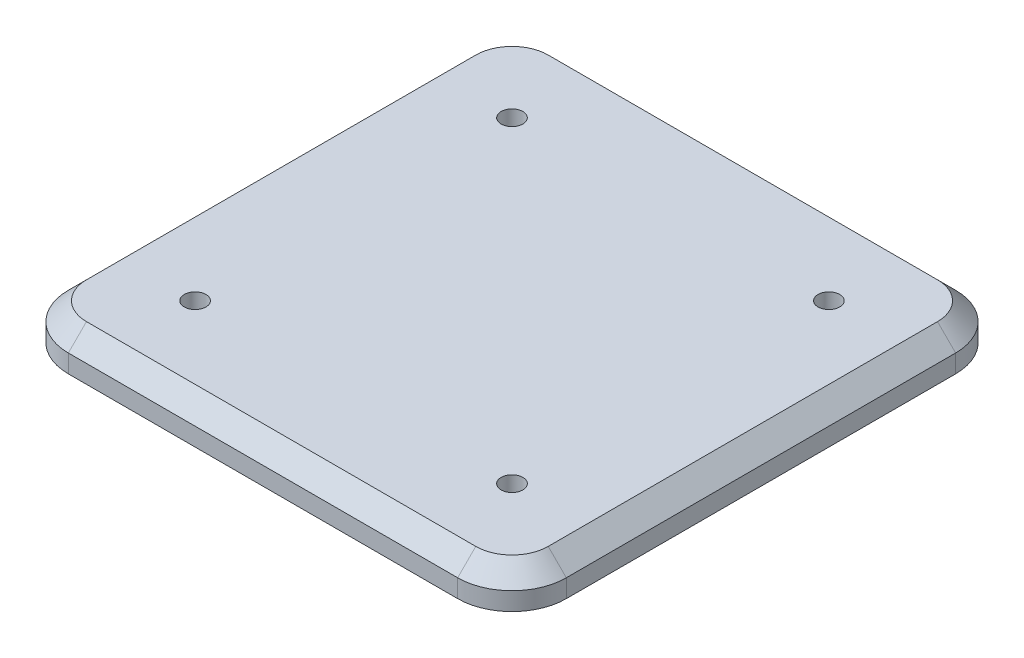
ISO-10303-21;
HEADER;
FILE_DESCRIPTION(('STEP AP214'),'2;1');
FILE_NAME('part.step','',(''),(''),'','','');
FILE_SCHEMA(('AUTOMOTIVE_DESIGN { 1 0 10303 214 1 1 1 1 }'));
ENDSEC;
DATA;
#1=APPLICATION_CONTEXT('core data for automotive mechanical design processes');
#2=APPLICATION_PROTOCOL_DEFINITION('international standard','automotive_design',2000,#1);
#3=PRODUCT_CONTEXT('',#1,'mechanical');
#4=PRODUCT('Part','Part','',(#3));
#5=PRODUCT_RELATED_PRODUCT_CATEGORY('part','',(#4));
#6=PRODUCT_DEFINITION_FORMATION('','',#4);
#7=PRODUCT_DEFINITION_CONTEXT('part definition',#1,'design');
#8=PRODUCT_DEFINITION('design','',#6,#7);
#9=PRODUCT_DEFINITION_SHAPE('','',#8);
#10=(LENGTH_UNIT() NAMED_UNIT(*) SI_UNIT(.MILLI.,.METRE.));
#11=(NAMED_UNIT(*) PLANE_ANGLE_UNIT() SI_UNIT($,.RADIAN.));
#12=(NAMED_UNIT(*) SI_UNIT($,.STERADIAN.) SOLID_ANGLE_UNIT());
#13=UNCERTAINTY_MEASURE_WITH_UNIT(LENGTH_MEASURE(1.E-05),#10,'distance_accuracy_value','');
#14=(GEOMETRIC_REPRESENTATION_CONTEXT(3) GLOBAL_UNCERTAINTY_ASSIGNED_CONTEXT((#13)) GLOBAL_UNIT_ASSIGNED_CONTEXT((#10,
#11,#12)) REPRESENTATION_CONTEXT('',''));
#15=CARTESIAN_POINT('',(0.,0.,0.));
#16=DIRECTION('',(0.,0.,1.));
#17=DIRECTION('',(1.,0.,0.));
#18=AXIS2_PLACEMENT_3D('',#15,#16,#17);
#19=CARTESIAN_POINT('',(-107.5,10.,107.5));
#20=DIRECTION('',(0.,-1.,0.));
#21=DIRECTION('',(0.,0.,-1.));
#22=AXIS2_PLACEMENT_3D('',#19,#20,#21);
#23=CYLINDRICAL_SURFACE('',#22,30.);
#24=DIRECTION('',(0.,-1.,0.));
#25=VECTOR('',#24,1.);
#26=CARTESIAN_POINT('',(-107.5,10.,137.5));
#27=LINE('',#26,#25);
#28=CARTESIAN_POINT('',(-107.5,0.,137.5));
#29=VERTEX_POINT('',#28);
#30=CARTESIAN_POINT('',(-107.5,-10.,137.5));
#31=VERTEX_POINT('',#30);
#32=EDGE_CURVE('E133',#29,#31,#27,.T.);
#33=ORIENTED_EDGE('',*,*,#32,.F.);
#34=CARTESIAN_POINT('',(-107.5,0.,107.5));
#35=DIRECTION('',(0.,-1.,0.));
#36=DIRECTION('',(0.,0.,-1.));
#37=AXIS2_PLACEMENT_3D('',#34,#35,#36);
#38=CIRCLE('',#37,30.);
#39=CARTESIAN_POINT('',(-137.5,0.,107.5));
#40=VERTEX_POINT('',#39);
#41=EDGE_CURVE('E12',#29,#40,#38,.T.);
#42=ORIENTED_EDGE('',*,*,#41,.T.);
#43=DIRECTION('',(0.,-1.,0.));
#44=VECTOR('',#43,1.);
#45=CARTESIAN_POINT('',(-137.5,10.,107.5));
#46=LINE('',#45,#44);
#47=CARTESIAN_POINT('',(-137.5,-10.,107.5));
#48=VERTEX_POINT('',#47);
#49=EDGE_CURVE('E156',#40,#48,#46,.T.);
#50=ORIENTED_EDGE('',*,*,#49,.T.);
#51=CARTESIAN_POINT('',(-107.5,-10.,107.5));
#52=DIRECTION('',(0.,1.,0.));
#53=DIRECTION('',(0.,0.,-1.));
#54=AXIS2_PLACEMENT_3D('',#51,#52,#53);
#55=CIRCLE('',#54,30.);
#56=EDGE_CURVE('E149',#48,#31,#55,.T.);
#57=ORIENTED_EDGE('',*,*,#56,.T.);
#58=EDGE_LOOP('',(#33,#42,#50,#57));
#59=FACE_BOUND('',#58,.T.);
#60=ADVANCED_FACE('F43',(#59),#23,.T.);
#61=CARTESIAN_POINT('',(107.5,10.,137.5));
#62=DIRECTION('',(0.,0.,-1.));
#63=DIRECTION('',(-1.,0.,0.));
#64=AXIS2_PLACEMENT_3D('',#61,#62,#63);
#65=PLANE('',#64);
#66=DIRECTION('',(0.,-1.,0.));
#67=VECTOR('',#66,1.);
#68=CARTESIAN_POINT('',(107.5,10.,137.5));
#69=LINE('',#68,#67);
#70=CARTESIAN_POINT('',(107.5,0.,137.5));
#71=VERTEX_POINT('',#70);
#72=CARTESIAN_POINT('',(107.5,-10.,137.5));
#73=VERTEX_POINT('',#72);
#74=EDGE_CURVE('E143',#71,#73,#69,.T.);
#75=ORIENTED_EDGE('',*,*,#74,.F.);
#76=DIRECTION('',(-1.,0.,0.));
#77=VECTOR('',#76,1.);
#78=CARTESIAN_POINT('',(107.5,0.,137.5));
#79=LINE('',#78,#77);
#80=EDGE_CURVE('E54',#71,#29,#79,.T.);
#81=ORIENTED_EDGE('',*,*,#80,.T.);
#82=ORIENTED_EDGE('',*,*,#32,.T.);
#83=DIRECTION('',(1.,0.,0.));
#84=VECTOR('',#83,1.);
#85=CARTESIAN_POINT('',(107.5,-10.,137.5));
#86=LINE('',#85,#84);
#87=EDGE_CURVE('E136',#31,#73,#86,.T.);
#88=ORIENTED_EDGE('',*,*,#87,.T.);
#89=EDGE_LOOP('',(#75,#81,#82,#88));
#90=FACE_BOUND('',#89,.T.);
#91=ADVANCED_FACE('F135',(#90),#65,.F.);
#92=CARTESIAN_POINT('',(107.5,10.,107.5));
#93=DIRECTION('',(0.,-1.,0.));
#94=DIRECTION('',(0.,0.,-1.));
#95=AXIS2_PLACEMENT_3D('',#92,#93,#94);
#96=CYLINDRICAL_SURFACE('',#95,30.);
#97=DIRECTION('',(0.,-1.,0.));
#98=VECTOR('',#97,1.);
#99=CARTESIAN_POINT('',(137.5,10.,107.5));
#100=LINE('',#99,#98);
#101=CARTESIAN_POINT('',(137.5,0.,107.5));
#102=VERTEX_POINT('',#101);
#103=CARTESIAN_POINT('',(137.5,-10.,107.5));
#104=VERTEX_POINT('',#103);
#105=EDGE_CURVE('E202',#102,#104,#100,.T.);
#106=ORIENTED_EDGE('',*,*,#105,.F.);
#107=CARTESIAN_POINT('',(107.5,0.,107.5));
#108=DIRECTION('',(0.,-1.,0.));
#109=DIRECTION('',(0.,0.,-1.));
#110=AXIS2_PLACEMENT_3D('',#107,#108,#109);
#111=CIRCLE('',#110,30.);
#112=EDGE_CURVE('E69',#102,#71,#111,.T.);
#113=ORIENTED_EDGE('',*,*,#112,.T.);
#114=ORIENTED_EDGE('',*,*,#74,.T.);
#115=CARTESIAN_POINT('',(107.5,-10.,107.5));
#116=DIRECTION('',(0.,1.,0.));
#117=DIRECTION('',(0.,0.,-1.));
#118=AXIS2_PLACEMENT_3D('',#115,#116,#117);
#119=CIRCLE('',#118,30.);
#120=EDGE_CURVE('E152',#73,#104,#119,.T.);
#121=ORIENTED_EDGE('',*,*,#120,.T.);
#122=EDGE_LOOP('',(#106,#113,#114,#121));
#123=FACE_BOUND('',#122,.T.);
#124=ADVANCED_FACE('F329',(#123),#96,.T.);
#125=CARTESIAN_POINT('',(137.5,10.,-107.5));
#126=DIRECTION('',(-1.,0.,0.));
#127=DIRECTION('',(0.,0.,1.));
#128=AXIS2_PLACEMENT_3D('',#125,#126,#127);
#129=PLANE('',#128);
#130=DIRECTION('',(0.,-1.,0.));
#131=VECTOR('',#130,1.);
#132=CARTESIAN_POINT('',(137.5,10.,-107.5));
#133=LINE('',#132,#131);
#134=CARTESIAN_POINT('',(137.5,0.,-107.5));
#135=VERTEX_POINT('',#134);
#136=CARTESIAN_POINT('',(137.5,-10.,-107.5));
#137=VERTEX_POINT('',#136);
#138=EDGE_CURVE('E199',#135,#137,#133,.T.);
#139=ORIENTED_EDGE('',*,*,#138,.F.);
#140=DIRECTION('',(0.,0.,1.));
#141=VECTOR('',#140,1.);
#142=CARTESIAN_POINT('',(137.5,0.,-107.5));
#143=LINE('',#142,#141);
#144=EDGE_CURVE('E244',#135,#102,#143,.T.);
#145=ORIENTED_EDGE('',*,*,#144,.T.);
#146=ORIENTED_EDGE('',*,*,#105,.T.);
#147=DIRECTION('',(0.,0.,-1.));
#148=VECTOR('',#147,1.);
#149=CARTESIAN_POINT('',(137.5,-10.,-107.5));
#150=LINE('',#149,#148);
#151=EDGE_CURVE('E169',#104,#137,#150,.T.);
#152=ORIENTED_EDGE('',*,*,#151,.T.);
#153=EDGE_LOOP('',(#139,#145,#146,#152));
#154=FACE_BOUND('',#153,.T.);
#155=ADVANCED_FACE('F327',(#154),#129,.F.);
#156=CARTESIAN_POINT('',(107.5,10.,-107.5));
#157=DIRECTION('',(0.,-1.,0.));
#158=DIRECTION('',(0.,0.,-1.));
#159=AXIS2_PLACEMENT_3D('',#156,#157,#158);
#160=CYLINDRICAL_SURFACE('',#159,30.);
#161=DIRECTION('',(0.,-1.,0.));
#162=VECTOR('',#161,1.);
#163=CARTESIAN_POINT('',(107.5,10.,-137.5));
#164=LINE('',#163,#162);
#165=CARTESIAN_POINT('',(107.5,0.,-137.5));
#166=VERTEX_POINT('',#165);
#167=CARTESIAN_POINT('',(107.5,-10.,-137.5));
#168=VERTEX_POINT('',#167);
#169=EDGE_CURVE('E196',#166,#168,#164,.T.);
#170=ORIENTED_EDGE('',*,*,#169,.F.);
#171=CARTESIAN_POINT('',(107.5,0.,-107.5));
#172=DIRECTION('',(0.,-1.,0.));
#173=DIRECTION('',(0.,0.,-1.));
#174=AXIS2_PLACEMENT_3D('',#171,#172,#173);
#175=CIRCLE('',#174,30.);
#176=EDGE_CURVE('E241',#166,#135,#175,.T.);
#177=ORIENTED_EDGE('',*,*,#176,.T.);
#178=ORIENTED_EDGE('',*,*,#138,.T.);
#179=CARTESIAN_POINT('',(107.5,-10.,-107.5));
#180=DIRECTION('',(0.,1.,0.));
#181=DIRECTION('',(0.,0.,-1.));
#182=AXIS2_PLACEMENT_3D('',#179,#180,#181);
#183=CIRCLE('',#182,30.);
#184=EDGE_CURVE('E173',#137,#168,#183,.T.);
#185=ORIENTED_EDGE('',*,*,#184,.T.);
#186=EDGE_LOOP('',(#170,#177,#178,#185));
#187=FACE_BOUND('',#186,.T.);
#188=ADVANCED_FACE('F325',(#187),#160,.T.);
#189=CARTESIAN_POINT('',(-107.5,10.,-137.5));
#190=DIRECTION('',(0.,0.,1.));
#191=DIRECTION('',(1.,0.,0.));
#192=AXIS2_PLACEMENT_3D('',#189,#190,#191);
#193=PLANE('',#192);
#194=DIRECTION('',(0.,-1.,0.));
#195=VECTOR('',#194,1.);
#196=CARTESIAN_POINT('',(-107.5,10.,-137.5));
#197=LINE('',#196,#195);
#198=CARTESIAN_POINT('',(-107.5,0.,-137.5));
#199=VERTEX_POINT('',#198);
#200=CARTESIAN_POINT('',(-107.5,-10.,-137.5));
#201=VERTEX_POINT('',#200);
#202=EDGE_CURVE('E193',#199,#201,#197,.T.);
#203=ORIENTED_EDGE('',*,*,#202,.F.);
#204=DIRECTION('',(1.,0.,0.));
#205=VECTOR('',#204,1.);
#206=CARTESIAN_POINT('',(-107.5,0.,-137.5));
#207=LINE('',#206,#205);
#208=EDGE_CURVE('E238',#199,#166,#207,.T.);
#209=ORIENTED_EDGE('',*,*,#208,.T.);
#210=ORIENTED_EDGE('',*,*,#169,.T.);
#211=DIRECTION('',(-1.,0.,0.));
#212=VECTOR('',#211,1.);
#213=CARTESIAN_POINT('',(-107.5,-10.,-137.5));
#214=LINE('',#213,#212);
#215=EDGE_CURVE('E177',#168,#201,#214,.T.);
#216=ORIENTED_EDGE('',*,*,#215,.T.);
#217=EDGE_LOOP('',(#203,#209,#210,#216));
#218=FACE_BOUND('',#217,.T.);
#219=ADVANCED_FACE('F313',(#218),#193,.F.);
#220=CARTESIAN_POINT('',(-107.5,10.,-107.5));
#221=DIRECTION('',(0.,-1.,0.));
#222=DIRECTION('',(0.,0.,-1.));
#223=AXIS2_PLACEMENT_3D('',#220,#221,#222);
#224=CYLINDRICAL_SURFACE('',#223,30.);
#225=DIRECTION('',(0.,-1.,0.));
#226=VECTOR('',#225,1.);
#227=CARTESIAN_POINT('',(-137.5,10.,-107.5));
#228=LINE('',#227,#226);
#229=CARTESIAN_POINT('',(-137.5,0.,-107.5));
#230=VERTEX_POINT('',#229);
#231=CARTESIAN_POINT('',(-137.5,-10.,-107.5));
#232=VERTEX_POINT('',#231);
#233=EDGE_CURVE('E190',#230,#232,#228,.T.);
#234=ORIENTED_EDGE('',*,*,#233,.F.);
#235=CARTESIAN_POINT('',(-107.5,0.,-107.5));
#236=DIRECTION('',(0.,-1.,0.));
#237=DIRECTION('',(0.,0.,-1.));
#238=AXIS2_PLACEMENT_3D('',#235,#236,#237);
#239=CIRCLE('',#238,30.);
#240=EDGE_CURVE('E235',#230,#199,#239,.T.);
#241=ORIENTED_EDGE('',*,*,#240,.T.);
#242=ORIENTED_EDGE('',*,*,#202,.T.);
#243=CARTESIAN_POINT('',(-107.5,-10.,-107.5));
#244=DIRECTION('',(0.,1.,0.));
#245=DIRECTION('',(0.,0.,1.));
#246=AXIS2_PLACEMENT_3D('',#243,#244,#245);
#247=CIRCLE('',#246,30.);
#248=EDGE_CURVE('E181',#201,#232,#247,.T.);
#249=ORIENTED_EDGE('',*,*,#248,.T.);
#250=EDGE_LOOP('',(#234,#241,#242,#249));
#251=FACE_BOUND('',#250,.T.);
#252=ADVANCED_FACE('F310',(#251),#224,.T.);
#253=CARTESIAN_POINT('',(-137.5,10.,107.5));
#254=DIRECTION('',(1.,0.,0.));
#255=DIRECTION('',(0.,0.,-1.));
#256=AXIS2_PLACEMENT_3D('',#253,#254,#255);
#257=PLANE('',#256);
#258=ORIENTED_EDGE('',*,*,#49,.F.);
#259=DIRECTION('',(0.,0.,-1.));
#260=VECTOR('',#259,1.);
#261=CARTESIAN_POINT('',(-137.5,0.,107.5));
#262=LINE('',#261,#260);
#263=EDGE_CURVE('E231',#40,#230,#262,.T.);
#264=ORIENTED_EDGE('',*,*,#263,.T.);
#265=ORIENTED_EDGE('',*,*,#233,.T.);
#266=DIRECTION('',(0.,0.,1.));
#267=VECTOR('',#266,1.);
#268=CARTESIAN_POINT('',(-137.5,-10.,107.5));
#269=LINE('',#268,#267);
#270=EDGE_CURVE('E185',#232,#48,#269,.T.);
#271=ORIENTED_EDGE('',*,*,#270,.T.);
#272=EDGE_LOOP('',(#258,#264,#265,#271));
#273=FACE_BOUND('',#272,.T.);
#274=ADVANCED_FACE('F297',(#273),#257,.F.);
#275=CARTESIAN_POINT('',(-107.5,10.,107.5));
#276=DIRECTION('',(0.,-1.,0.));
#277=DIRECTION('',(0.,0.,-1.));
#278=AXIS2_PLACEMENT_3D('',#275,#276,#277);
#279=PLANE('',#278);
#280=CARTESIAN_POINT('',(-87.5,10.,-87.5));
#281=DIRECTION('',(0.,1.,0.));
#282=DIRECTION('',(0.,0.,-1.));
#283=AXIS2_PLACEMENT_3D('',#280,#281,#282);
#284=CIRCLE('',#283,6.);
#285=CARTESIAN_POINT('',(-87.5,10.,-93.5));
#286=VERTEX_POINT('',#285);
#287=EDGE_CURVE('E629',#286,#286,#284,.T.);
#288=ORIENTED_EDGE('',*,*,#287,.F.);
#289=EDGE_LOOP('',(#288));
#290=FACE_BOUND('',#289,.T.);
#291=CARTESIAN_POINT('',(87.5,10.,87.5));
#292=DIRECTION('',(0.,1.,0.));
#293=DIRECTION('',(0.,0.,-1.));
#294=AXIS2_PLACEMENT_3D('',#291,#292,#293);
#295=CIRCLE('',#294,6.);
#296=CARTESIAN_POINT('',(87.5,10.,81.5));
#297=VERTEX_POINT('',#296);
#298=EDGE_CURVE('E628',#297,#297,#295,.T.);
#299=ORIENTED_EDGE('',*,*,#298,.F.);
#300=EDGE_LOOP('',(#299));
#301=FACE_BOUND('',#300,.T.);
#302=CARTESIAN_POINT('',(-87.5,10.,87.5));
#303=DIRECTION('',(0.,1.,0.));
#304=DIRECTION('',(0.,0.,1.));
#305=AXIS2_PLACEMENT_3D('',#302,#303,#304);
#306=CIRCLE('',#305,6.);
#307=CARTESIAN_POINT('',(-87.5,10.,93.5));
#308=VERTEX_POINT('',#307);
#309=EDGE_CURVE('E620',#308,#308,#306,.T.);
#310=ORIENTED_EDGE('',*,*,#309,.F.);
#311=EDGE_LOOP('',(#310));
#312=FACE_BOUND('',#311,.T.);
#313=CARTESIAN_POINT('',(87.5,10.,-87.5));
#314=DIRECTION('',(0.,1.,0.));
#315=DIRECTION('',(0.,0.,1.));
#316=AXIS2_PLACEMENT_3D('',#313,#314,#315);
#317=CIRCLE('',#316,6.);
#318=CARTESIAN_POINT('',(87.5,10.,-81.5));
#319=VERTEX_POINT('',#318);
#320=EDGE_CURVE('E638',#319,#319,#317,.T.);
#321=ORIENTED_EDGE('',*,*,#320,.F.);
#322=EDGE_LOOP('',(#321));
#323=FACE_BOUND('',#322,.T.);
#324=CARTESIAN_POINT('',(-107.5,10.,-107.5));
#325=DIRECTION('',(0.,-1.,0.));
#326=DIRECTION('',(0.,0.,-1.));
#327=AXIS2_PLACEMENT_3D('',#324,#325,#326);
#328=CIRCLE('',#327,20.);
#329=CARTESIAN_POINT('',(-107.5,10.,-127.5));
#330=VERTEX_POINT('',#329);
#331=CARTESIAN_POINT('',(-127.5,10.,-107.5));
#332=VERTEX_POINT('',#331);
#333=EDGE_CURVE('E224',#330,#332,#328,.F.);
#334=ORIENTED_EDGE('',*,*,#333,.T.);
#335=DIRECTION('',(0.,0.,1.));
#336=VECTOR('',#335,1.);
#337=CARTESIAN_POINT('',(-127.5,10.,107.5));
#338=LINE('',#337,#336);
#339=CARTESIAN_POINT('',(-127.5,10.,107.5));
#340=VERTEX_POINT('',#339);
#341=EDGE_CURVE('E227',#332,#340,#338,.T.);
#342=ORIENTED_EDGE('',*,*,#341,.T.);
#343=CARTESIAN_POINT('',(-107.5,10.,107.5));
#344=DIRECTION('',(0.,-1.,0.));
#345=DIRECTION('',(0.,0.,-1.));
#346=AXIS2_PLACEMENT_3D('',#343,#344,#345);
#347=CIRCLE('',#346,20.);
#348=CARTESIAN_POINT('',(-107.5,10.,127.5));
#349=VERTEX_POINT('',#348);
#350=EDGE_CURVE('E142',#340,#349,#347,.F.);
#351=ORIENTED_EDGE('',*,*,#350,.T.);
#352=DIRECTION('',(1.,0.,0.));
#353=VECTOR('',#352,1.);
#354=CARTESIAN_POINT('',(-107.5,10.,127.5));
#355=LINE('',#354,#353);
#356=CARTESIAN_POINT('',(107.5,10.,127.5));
#357=VERTEX_POINT('',#356);
#358=EDGE_CURVE('E209',#349,#357,#355,.T.);
#359=ORIENTED_EDGE('',*,*,#358,.T.);
#360=CARTESIAN_POINT('',(107.5,10.,107.5));
#361=DIRECTION('',(0.,-1.,0.));
#362=DIRECTION('',(0.,0.,-1.));
#363=AXIS2_PLACEMENT_3D('',#360,#361,#362);
#364=CIRCLE('',#363,20.);
#365=CARTESIAN_POINT('',(127.5,10.,107.5));
#366=VERTEX_POINT('',#365);
#367=EDGE_CURVE('E212',#357,#366,#364,.F.);
#368=ORIENTED_EDGE('',*,*,#367,.T.);
#369=DIRECTION('',(0.,0.,-1.));
#370=VECTOR('',#369,1.);
#371=CARTESIAN_POINT('',(127.5,10.,107.5));
#372=LINE('',#371,#370);
#373=CARTESIAN_POINT('',(127.5,10.,-107.5));
#374=VERTEX_POINT('',#373);
#375=EDGE_CURVE('E215',#366,#374,#372,.T.);
#376=ORIENTED_EDGE('',*,*,#375,.T.);
#377=CARTESIAN_POINT('',(107.5,10.,-107.5));
#378=DIRECTION('',(0.,-1.,0.));
#379=DIRECTION('',(0.,0.,-1.));
#380=AXIS2_PLACEMENT_3D('',#377,#378,#379);
#381=CIRCLE('',#380,20.);
#382=CARTESIAN_POINT('',(107.5,10.,-127.5));
#383=VERTEX_POINT('',#382);
#384=EDGE_CURVE('E218',#374,#383,#381,.F.);
#385=ORIENTED_EDGE('',*,*,#384,.T.);
#386=DIRECTION('',(-1.,0.,0.));
#387=VECTOR('',#386,1.);
#388=CARTESIAN_POINT('',(-107.5,10.,-127.5));
#389=LINE('',#388,#387);
#390=EDGE_CURVE('E221',#383,#330,#389,.T.);
#391=ORIENTED_EDGE('',*,*,#390,.T.);
#392=EDGE_LOOP('',(#334,#342,#351,#359,#368,#376,#385,#391));
#393=FACE_BOUND('',#392,.T.);
#394=ADVANCED_FACE('F285',(#290,#301,#312,#323,#393),#279,.F.);
#395=CARTESIAN_POINT('',(-107.5,-10.,107.5));
#396=DIRECTION('',(0.,-1.,0.));
#397=DIRECTION('',(0.,0.,-1.));
#398=AXIS2_PLACEMENT_3D('',#395,#396,#397);
#399=PLANE('',#398);
#400=CARTESIAN_POINT('',(-112.5,-10.,112.5));
#401=DIRECTION('',(0.,-1.,0.));
#402=DIRECTION('',(0.,0.,1.));
#403=AXIS2_PLACEMENT_3D('',#400,#401,#402);
#404=CIRCLE('',#403,6.);
#405=CARTESIAN_POINT('',(-112.5,-10.,118.5));
#406=VERTEX_POINT('',#405);
#407=EDGE_CURVE('E597',#406,#406,#404,.T.);
#408=ORIENTED_EDGE('',*,*,#407,.F.);
#409=EDGE_LOOP('',(#408));
#410=FACE_BOUND('',#409,.T.);
#411=CARTESIAN_POINT('',(112.5,-10.,-112.5));
#412=DIRECTION('',(0.,-1.,0.));
#413=DIRECTION('',(0.,0.,1.));
#414=AXIS2_PLACEMENT_3D('',#411,#412,#413);
#415=CIRCLE('',#414,6.);
#416=CARTESIAN_POINT('',(112.5,-10.,-106.5));
#417=VERTEX_POINT('',#416);
#418=EDGE_CURVE('E609',#417,#417,#415,.T.);
#419=ORIENTED_EDGE('',*,*,#418,.F.);
#420=EDGE_LOOP('',(#419));
#421=FACE_BOUND('',#420,.T.);
#422=CARTESIAN_POINT('',(-112.5,-10.,-112.5));
#423=DIRECTION('',(0.,-1.,0.));
#424=DIRECTION('',(0.,0.,-1.));
#425=AXIS2_PLACEMENT_3D('',#422,#423,#424);
#426=CIRCLE('',#425,6.);
#427=CARTESIAN_POINT('',(-112.5,-10.,-118.5));
#428=VERTEX_POINT('',#427);
#429=EDGE_CURVE('E673',#428,#428,#426,.T.);
#430=ORIENTED_EDGE('',*,*,#429,.F.);
#431=EDGE_LOOP('',(#430));
#432=FACE_BOUND('',#431,.T.);
#433=CARTESIAN_POINT('',(112.5,-10.,112.5));
#434=DIRECTION('',(0.,-1.,0.));
#435=DIRECTION('',(0.,0.,-1.));
#436=AXIS2_PLACEMENT_3D('',#433,#434,#435);
#437=CIRCLE('',#436,6.);
#438=CARTESIAN_POINT('',(112.5,-10.,106.5));
#439=VERTEX_POINT('',#438);
#440=EDGE_CURVE('E596',#439,#439,#437,.T.);
#441=ORIENTED_EDGE('',*,*,#440,.F.);
#442=EDGE_LOOP('',(#441));
#443=FACE_BOUND('',#442,.T.);
#444=ORIENTED_EDGE('',*,*,#56,.F.);
#445=ORIENTED_EDGE('',*,*,#270,.F.);
#446=ORIENTED_EDGE('',*,*,#248,.F.);
#447=ORIENTED_EDGE('',*,*,#215,.F.);
#448=ORIENTED_EDGE('',*,*,#184,.F.);
#449=ORIENTED_EDGE('',*,*,#151,.F.);
#450=ORIENTED_EDGE('',*,*,#120,.F.);
#451=ORIENTED_EDGE('',*,*,#87,.F.);
#452=EDGE_LOOP('',(#444,#445,#446,#447,#448,#449,#450,#451));
#453=FACE_BOUND('',#452,.T.);
#454=ADVANCED_FACE('F147',(#410,#421,#432,#443,#453),#399,.T.);
#455=CARTESIAN_POINT('',(127.5,10.,107.5));
#456=DIRECTION('',(-0.707106781186549,-0.707106781186546,0.));
#457=DIRECTION('',(0.,0.,-1.));
#458=AXIS2_PLACEMENT_3D('',#455,#456,#457);
#459=PLANE('',#458);
#460=DIRECTION('',(-0.707106781186546,0.707106781186549,0.));
#461=VECTOR('',#460,1.);
#462=CARTESIAN_POINT('',(137.5,0.,107.5));
#463=LINE('',#462,#461);
#464=EDGE_CURVE('E162',#102,#366,#463,.T.);
#465=ORIENTED_EDGE('',*,*,#464,.F.);
#466=ORIENTED_EDGE('',*,*,#144,.F.);
#467=DIRECTION('',(0.707106781186546,-0.707106781186549,0.));
#468=VECTOR('',#467,1.);
#469=CARTESIAN_POINT('',(127.5,10.,-107.5));
#470=LINE('',#469,#468);
#471=EDGE_CURVE('E48',#374,#135,#470,.T.);
#472=ORIENTED_EDGE('',*,*,#471,.F.);
#473=ORIENTED_EDGE('',*,*,#375,.F.);
#474=EDGE_LOOP('',(#465,#466,#472,#473));
#475=FACE_BOUND('',#474,.T.);
#476=ADVANCED_FACE('F46',(#475),#459,.F.);
#477=CARTESIAN_POINT('',(107.5,10.,-107.5));
#478=DIRECTION('',(0.,-1.,0.));
#479=DIRECTION('',(0.,0.,-1.));
#480=AXIS2_PLACEMENT_3D('',#477,#478,#479);
#481=CONICAL_SURFACE('',#480,20.,0.785398163397446);
#482=ORIENTED_EDGE('',*,*,#471,.T.);
#483=ORIENTED_EDGE('',*,*,#176,.F.);
#484=DIRECTION('',(0.,-0.707106781186549,-0.707106781186546));
#485=VECTOR('',#484,1.);
#486=CARTESIAN_POINT('',(107.5,10.,-127.5));
#487=LINE('',#486,#485);
#488=EDGE_CURVE('E269',#383,#166,#487,.T.);
#489=ORIENTED_EDGE('',*,*,#488,.F.);
#490=ORIENTED_EDGE('',*,*,#384,.F.);
#491=EDGE_LOOP('',(#482,#483,#489,#490));
#492=FACE_BOUND('',#491,.T.);
#493=ADVANCED_FACE('F322',(#492),#481,.T.);
#494=CARTESIAN_POINT('',(107.5,10.,107.5));
#495=DIRECTION('',(0.,-1.,0.));
#496=DIRECTION('',(0.,0.,-1.));
#497=AXIS2_PLACEMENT_3D('',#494,#495,#496);
#498=CONICAL_SURFACE('',#497,20.,0.785398163397446);
#499=ORIENTED_EDGE('',*,*,#464,.T.);
#500=ORIENTED_EDGE('',*,*,#367,.F.);
#501=DIRECTION('',(0.,0.707106781186549,-0.707106781186546));
#502=VECTOR('',#501,1.);
#503=CARTESIAN_POINT('',(107.5,0.,137.5));
#504=LINE('',#503,#502);
#505=EDGE_CURVE('E265',#71,#357,#504,.T.);
#506=ORIENTED_EDGE('',*,*,#505,.F.);
#507=ORIENTED_EDGE('',*,*,#112,.F.);
#508=EDGE_LOOP('',(#499,#500,#506,#507));
#509=FACE_BOUND('',#508,.T.);
#510=ADVANCED_FACE('F277',(#509),#498,.T.);
#511=CARTESIAN_POINT('',(-107.5,10.,-127.5));
#512=DIRECTION('',(0.,-0.707106781186546,0.707106781186549));
#513=DIRECTION('',(-1.,0.,0.));
#514=AXIS2_PLACEMENT_3D('',#511,#512,#513);
#515=PLANE('',#514);
#516=ORIENTED_EDGE('',*,*,#488,.T.);
#517=ORIENTED_EDGE('',*,*,#208,.F.);
#518=DIRECTION('',(0.,-0.707106781186549,-0.707106781186546));
#519=VECTOR('',#518,1.);
#520=CARTESIAN_POINT('',(-107.5,10.,-127.5));
#521=LINE('',#520,#519);
#522=EDGE_CURVE('E261',#330,#199,#521,.T.);
#523=ORIENTED_EDGE('',*,*,#522,.F.);
#524=ORIENTED_EDGE('',*,*,#390,.F.);
#525=EDGE_LOOP('',(#516,#517,#523,#524));
#526=FACE_BOUND('',#525,.T.);
#527=ADVANCED_FACE('F318',(#526),#515,.F.);
#528=CARTESIAN_POINT('',(-107.5,10.,127.5));
#529=DIRECTION('',(0.,-0.707106781186546,-0.707106781186549));
#530=DIRECTION('',(1.,0.,0.));
#531=AXIS2_PLACEMENT_3D('',#528,#529,#530);
#532=PLANE('',#531);
#533=ORIENTED_EDGE('',*,*,#505,.T.);
#534=ORIENTED_EDGE('',*,*,#358,.F.);
#535=DIRECTION('',(0.,0.707106781186549,-0.707106781186546));
#536=VECTOR('',#535,1.);
#537=CARTESIAN_POINT('',(-107.5,0.,137.5));
#538=LINE('',#537,#536);
#539=EDGE_CURVE('E257',#29,#349,#538,.T.);
#540=ORIENTED_EDGE('',*,*,#539,.F.);
#541=ORIENTED_EDGE('',*,*,#80,.F.);
#542=EDGE_LOOP('',(#533,#534,#540,#541));
#543=FACE_BOUND('',#542,.T.);
#544=ADVANCED_FACE('F290',(#543),#532,.F.);
#545=CARTESIAN_POINT('',(-107.5,10.,-107.5));
#546=DIRECTION('',(0.,-1.,0.));
#547=DIRECTION('',(0.,0.,-1.));
#548=AXIS2_PLACEMENT_3D('',#545,#546,#547);
#549=CONICAL_SURFACE('',#548,20.,0.785398163397446);
#550=ORIENTED_EDGE('',*,*,#522,.T.);
#551=ORIENTED_EDGE('',*,*,#240,.F.);
#552=DIRECTION('',(-0.707106781186546,-0.707106781186549,0.));
#553=VECTOR('',#552,1.);
#554=CARTESIAN_POINT('',(-127.5,10.,-107.5));
#555=LINE('',#554,#553);
#556=EDGE_CURVE('E254',#332,#230,#555,.T.);
#557=ORIENTED_EDGE('',*,*,#556,.F.);
#558=ORIENTED_EDGE('',*,*,#333,.F.);
#559=EDGE_LOOP('',(#550,#551,#557,#558));
#560=FACE_BOUND('',#559,.T.);
#561=ADVANCED_FACE('F306',(#560),#549,.T.);
#562=CARTESIAN_POINT('',(-107.5,10.,107.5));
#563=DIRECTION('',(0.,-1.,0.));
#564=DIRECTION('',(0.,0.,-1.));
#565=AXIS2_PLACEMENT_3D('',#562,#563,#564);
#566=CONICAL_SURFACE('',#565,20.,0.785398163397446);
#567=ORIENTED_EDGE('',*,*,#539,.T.);
#568=ORIENTED_EDGE('',*,*,#350,.F.);
#569=DIRECTION('',(0.707106781186546,0.707106781186549,0.));
#570=VECTOR('',#569,1.);
#571=CARTESIAN_POINT('',(-137.5,0.,107.5));
#572=LINE('',#571,#570);
#573=EDGE_CURVE('E251',#40,#340,#572,.T.);
#574=ORIENTED_EDGE('',*,*,#573,.F.);
#575=ORIENTED_EDGE('',*,*,#41,.F.);
#576=EDGE_LOOP('',(#567,#568,#574,#575));
#577=FACE_BOUND('',#576,.T.);
#578=ADVANCED_FACE('F293',(#577),#566,.T.);
#579=CARTESIAN_POINT('',(-127.5,10.,107.5));
#580=DIRECTION('',(0.707106781186549,-0.707106781186546,0.));
#581=DIRECTION('',(0.,0.,1.));
#582=AXIS2_PLACEMENT_3D('',#579,#580,#581);
#583=PLANE('',#582);
#584=ORIENTED_EDGE('',*,*,#556,.T.);
#585=ORIENTED_EDGE('',*,*,#263,.F.);
#586=ORIENTED_EDGE('',*,*,#573,.T.);
#587=ORIENTED_EDGE('',*,*,#341,.F.);
#588=EDGE_LOOP('',(#584,#585,#586,#587));
#589=FACE_BOUND('',#588,.T.);
#590=ADVANCED_FACE('F300',(#589),#583,.F.);
#591=CARTESIAN_POINT('',(-107.5,0.,107.5));
#592=DIRECTION('',(0.,-1.,0.));
#593=DIRECTION('',(0.,0.,-1.));
#594=AXIS2_PLACEMENT_3D('',#591,#592,#593);
#595=PLANE('',#594);
#596=CARTESIAN_POINT('',(87.5,0.,-87.5));
#597=DIRECTION('',(0.,-1.,0.));
#598=DIRECTION('',(0.,0.,-1.));
#599=AXIS2_PLACEMENT_3D('',#596,#597,#598);
#600=CIRCLE('',#599,6.);
#601=CARTESIAN_POINT('',(87.5,0.,-93.5));
#602=VERTEX_POINT('',#601);
#603=EDGE_CURVE('E164',#602,#602,#600,.F.);
#604=ORIENTED_EDGE('',*,*,#603,.T.);
#605=EDGE_LOOP('',(#604));
#606=FACE_BOUND('',#605,.T.);
#607=ADVANCED_FACE('F349',(#606),#595,.F.);
#608=CARTESIAN_POINT('',(87.5,-26.9705627484772,-87.5));
#609=DIRECTION('',(0.,1.,0.));
#610=DIRECTION('',(0.,0.,1.));
#611=AXIS2_PLACEMENT_3D('',#608,#609,#610);
#612=CYLINDRICAL_SURFACE('',#611,6.);
#613=ORIENTED_EDGE('',*,*,#320,.T.);
#614=EDGE_LOOP('',(#613));
#615=FACE_BOUND('',#614,.T.);
#616=ORIENTED_EDGE('',*,*,#603,.F.);
#617=EDGE_LOOP('',(#616));
#618=FACE_BOUND('',#617,.T.);
#619=ADVANCED_FACE('F435',(#615,#618),#612,.F.);
#620=CARTESIAN_POINT('',(-107.5,0.,107.5));
#621=DIRECTION('',(0.,-1.,0.));
#622=DIRECTION('',(0.,0.,-1.));
#623=AXIS2_PLACEMENT_3D('',#620,#621,#622);
#624=PLANE('',#623);
#625=CARTESIAN_POINT('',(-87.5,0.,87.5));
#626=DIRECTION('',(0.,-1.,0.));
#627=DIRECTION('',(0.,0.,-1.));
#628=AXIS2_PLACEMENT_3D('',#625,#626,#627);
#629=CIRCLE('',#628,6.);
#630=CARTESIAN_POINT('',(-87.5,0.,81.5));
#631=VERTEX_POINT('',#630);
#632=EDGE_CURVE('E624',#631,#631,#629,.F.);
#633=ORIENTED_EDGE('',*,*,#632,.T.);
#634=EDGE_LOOP('',(#633));
#635=FACE_BOUND('',#634,.T.);
#636=ADVANCED_FACE('F444',(#635),#624,.F.);
#637=CARTESIAN_POINT('',(-87.5,-26.9705627484772,87.5));
#638=DIRECTION('',(0.,1.,0.));
#639=DIRECTION('',(0.,0.,1.));
#640=AXIS2_PLACEMENT_3D('',#637,#638,#639);
#641=CYLINDRICAL_SURFACE('',#640,6.);
#642=ORIENTED_EDGE('',*,*,#309,.T.);
#643=EDGE_LOOP('',(#642));
#644=FACE_BOUND('',#643,.T.);
#645=ORIENTED_EDGE('',*,*,#632,.F.);
#646=EDGE_LOOP('',(#645));
#647=FACE_BOUND('',#646,.T.);
#648=ADVANCED_FACE('F454',(#644,#647),#641,.F.);
#649=CARTESIAN_POINT('',(-107.5,0.,107.5));
#650=DIRECTION('',(0.,-1.,0.));
#651=DIRECTION('',(0.,0.,-1.));
#652=AXIS2_PLACEMENT_3D('',#649,#650,#651);
#653=PLANE('',#652);
#654=CARTESIAN_POINT('',(87.5,0.,87.5));
#655=DIRECTION('',(0.,-1.,0.));
#656=DIRECTION('',(0.,0.,-1.));
#657=AXIS2_PLACEMENT_3D('',#654,#655,#656);
#658=CIRCLE('',#657,6.);
#659=CARTESIAN_POINT('',(87.5,0.,81.5));
#660=VERTEX_POINT('',#659);
#661=EDGE_CURVE('E634',#660,#660,#658,.F.);
#662=ORIENTED_EDGE('',*,*,#661,.T.);
#663=EDGE_LOOP('',(#662));
#664=FACE_BOUND('',#663,.T.);
#665=ADVANCED_FACE('F464',(#664),#653,.F.);
#666=CARTESIAN_POINT('',(87.5,-26.9705627484772,87.5));
#667=DIRECTION('',(0.,1.,0.));
#668=DIRECTION('',(0.,0.,1.));
#669=AXIS2_PLACEMENT_3D('',#666,#667,#668);
#670=CYLINDRICAL_SURFACE('',#669,6.);
#671=ORIENTED_EDGE('',*,*,#298,.T.);
#672=EDGE_LOOP('',(#671));
#673=FACE_BOUND('',#672,.T.);
#674=ORIENTED_EDGE('',*,*,#661,.F.);
#675=EDGE_LOOP('',(#674));
#676=FACE_BOUND('',#675,.T.);
#677=ADVANCED_FACE('F474',(#673,#676),#670,.F.);
#678=CARTESIAN_POINT('',(-107.5,0.,107.5));
#679=DIRECTION('',(0.,-1.,0.));
#680=DIRECTION('',(0.,0.,-1.));
#681=AXIS2_PLACEMENT_3D('',#678,#679,#680);
#682=PLANE('',#681);
#683=CARTESIAN_POINT('',(-87.5,0.,-87.5));
#684=DIRECTION('',(0.,-1.,0.));
#685=DIRECTION('',(0.,0.,-1.));
#686=AXIS2_PLACEMENT_3D('',#683,#684,#685);
#687=CIRCLE('',#686,6.);
#688=CARTESIAN_POINT('',(-87.5,0.,-93.5));
#689=VERTEX_POINT('',#688);
#690=EDGE_CURVE('E633',#689,#689,#687,.F.);
#691=ORIENTED_EDGE('',*,*,#690,.T.);
#692=EDGE_LOOP('',(#691));
#693=FACE_BOUND('',#692,.T.);
#694=ADVANCED_FACE('F484',(#693),#682,.F.);
#695=CARTESIAN_POINT('',(-87.5,-26.9705627484772,-87.5));
#696=DIRECTION('',(0.,1.,0.));
#697=DIRECTION('',(0.,0.,1.));
#698=AXIS2_PLACEMENT_3D('',#695,#696,#697);
#699=CYLINDRICAL_SURFACE('',#698,6.);
#700=ORIENTED_EDGE('',*,*,#287,.T.);
#701=EDGE_LOOP('',(#700));
#702=FACE_BOUND('',#701,.T.);
#703=ORIENTED_EDGE('',*,*,#690,.F.);
#704=EDGE_LOOP('',(#703));
#705=FACE_BOUND('',#704,.T.);
#706=ADVANCED_FACE('F494',(#702,#705),#699,.F.);
#707=CARTESIAN_POINT('',(112.5,26.9705627484772,112.5));
#708=DIRECTION('',(0.,-1.,0.));
#709=DIRECTION('',(0.,0.,-1.));
#710=AXIS2_PLACEMENT_3D('',#707,#708,#709);
#711=CYLINDRICAL_SURFACE('',#710,6.);
#712=CARTESIAN_POINT('',(112.5,0.,112.5));
#713=DIRECTION('',(0.,-1.,0.));
#714=DIRECTION('',(0.,0.,-1.));
#715=AXIS2_PLACEMENT_3D('',#712,#713,#714);
#716=CIRCLE('',#715,6.);
#717=CARTESIAN_POINT('',(112.5,0.,106.5));
#718=VERTEX_POINT('',#717);
#719=EDGE_CURVE('E602',#718,#718,#716,.F.);
#720=ORIENTED_EDGE('',*,*,#719,.T.);
#721=EDGE_LOOP('',(#720));
#722=FACE_BOUND('',#721,.T.);
#723=ORIENTED_EDGE('',*,*,#440,.T.);
#724=EDGE_LOOP('',(#723));
#725=FACE_BOUND('',#724,.T.);
#726=ADVANCED_FACE('F503',(#722,#725),#711,.F.);
#727=CARTESIAN_POINT('',(-107.5,0.,107.5));
#728=DIRECTION('',(0.,-1.,0.));
#729=DIRECTION('',(0.,0.,-1.));
#730=AXIS2_PLACEMENT_3D('',#727,#728,#729);
#731=PLANE('',#730);
#732=ORIENTED_EDGE('',*,*,#719,.F.);
#733=EDGE_LOOP('',(#732));
#734=FACE_BOUND('',#733,.T.);
#735=ADVANCED_FACE('F518',(#734),#731,.T.);
#736=CARTESIAN_POINT('',(-112.5,26.9705627484772,-112.5));
#737=DIRECTION('',(0.,-1.,0.));
#738=DIRECTION('',(0.,0.,-1.));
#739=AXIS2_PLACEMENT_3D('',#736,#737,#738);
#740=CYLINDRICAL_SURFACE('',#739,6.);
#741=CARTESIAN_POINT('',(-112.5,0.,-112.5));
#742=DIRECTION('',(0.,-1.,0.));
#743=DIRECTION('',(0.,0.,-1.));
#744=AXIS2_PLACEMENT_3D('',#741,#742,#743);
#745=CIRCLE('',#744,6.);
#746=CARTESIAN_POINT('',(-112.5,0.,-118.5));
#747=VERTEX_POINT('',#746);
#748=EDGE_CURVE('E613',#747,#747,#745,.F.);
#749=ORIENTED_EDGE('',*,*,#748,.T.);
#750=EDGE_LOOP('',(#749));
#751=FACE_BOUND('',#750,.T.);
#752=ORIENTED_EDGE('',*,*,#429,.T.);
#753=EDGE_LOOP('',(#752));
#754=FACE_BOUND('',#753,.T.);
#755=ADVANCED_FACE('F528',(#751,#754),#740,.F.);
#756=CARTESIAN_POINT('',(-107.5,0.,107.5));
#757=DIRECTION('',(0.,-1.,0.));
#758=DIRECTION('',(0.,0.,-1.));
#759=AXIS2_PLACEMENT_3D('',#756,#757,#758);
#760=PLANE('',#759);
#761=ORIENTED_EDGE('',*,*,#748,.F.);
#762=EDGE_LOOP('',(#761));
#763=FACE_BOUND('',#762,.T.);
#764=ADVANCED_FACE('F538',(#763),#760,.T.);
#765=CARTESIAN_POINT('',(112.5,26.9705627484772,-112.5));
#766=DIRECTION('',(0.,-1.,0.));
#767=DIRECTION('',(0.,0.,-1.));
#768=AXIS2_PLACEMENT_3D('',#765,#766,#767);
#769=CYLINDRICAL_SURFACE('',#768,6.);
#770=CARTESIAN_POINT('',(112.5,0.,-112.5));
#771=DIRECTION('',(0.,-1.,0.));
#772=DIRECTION('',(0.,0.,-1.));
#773=AXIS2_PLACEMENT_3D('',#770,#771,#772);
#774=CIRCLE('',#773,6.);
#775=CARTESIAN_POINT('',(112.5,0.,-118.5));
#776=VERTEX_POINT('',#775);
#777=EDGE_CURVE('E605',#776,#776,#774,.F.);
#778=ORIENTED_EDGE('',*,*,#777,.T.);
#779=EDGE_LOOP('',(#778));
#780=FACE_BOUND('',#779,.T.);
#781=ORIENTED_EDGE('',*,*,#418,.T.);
#782=EDGE_LOOP('',(#781));
#783=FACE_BOUND('',#782,.T.);
#784=ADVANCED_FACE('F548',(#780,#783),#769,.F.);
#785=CARTESIAN_POINT('',(-107.5,0.,107.5));
#786=DIRECTION('',(0.,-1.,0.));
#787=DIRECTION('',(0.,0.,-1.));
#788=AXIS2_PLACEMENT_3D('',#785,#786,#787);
#789=PLANE('',#788);
#790=ORIENTED_EDGE('',*,*,#777,.F.);
#791=EDGE_LOOP('',(#790));
#792=FACE_BOUND('',#791,.T.);
#793=ADVANCED_FACE('F558',(#792),#789,.T.);
#794=CARTESIAN_POINT('',(-112.5,26.9705627484772,112.5));
#795=DIRECTION('',(0.,-1.,0.));
#796=DIRECTION('',(0.,0.,-1.));
#797=AXIS2_PLACEMENT_3D('',#794,#795,#796);
#798=CYLINDRICAL_SURFACE('',#797,6.);
#799=CARTESIAN_POINT('',(-112.5,0.,112.5));
#800=DIRECTION('',(0.,-1.,0.));
#801=DIRECTION('',(0.,0.,-1.));
#802=AXIS2_PLACEMENT_3D('',#799,#800,#801);
#803=CIRCLE('',#802,6.);
#804=CARTESIAN_POINT('',(-112.5,0.,106.5));
#805=VERTEX_POINT('',#804);
#806=EDGE_CURVE('E594',#805,#805,#803,.F.);
#807=ORIENTED_EDGE('',*,*,#806,.T.);
#808=EDGE_LOOP('',(#807));
#809=FACE_BOUND('',#808,.T.);
#810=ORIENTED_EDGE('',*,*,#407,.T.);
#811=EDGE_LOOP('',(#810));
#812=FACE_BOUND('',#811,.T.);
#813=ADVANCED_FACE('F568',(#809,#812),#798,.F.);
#814=CARTESIAN_POINT('',(-107.5,0.,107.5));
#815=DIRECTION('',(0.,-1.,0.));
#816=DIRECTION('',(0.,0.,-1.));
#817=AXIS2_PLACEMENT_3D('',#814,#815,#816);
#818=PLANE('',#817);
#819=ORIENTED_EDGE('',*,*,#806,.F.);
#820=EDGE_LOOP('',(#819));
#821=FACE_BOUND('',#820,.T.);
#822=ADVANCED_FACE('F578',(#821),#818,.T.);
#823=CLOSED_SHELL('',(#60,#91,#124,#155,#188,#219,#252,#274,#394,#454,#476,#493,#510,#527,#544,
#561,#578,#590,#607,#619,#636,#648,#665,#677,#694,#706,#726,#735,#755,#764,#784,#793,#813,#822));
#824=MANIFOLD_SOLID_BREP('B2',#823);
#825=ADVANCED_BREP_SHAPE_REPRESENTATION('',(#18,#824),#14);
#826=SHAPE_DEFINITION_REPRESENTATION(#9,#825);
ENDSEC;
END-ISO-10303-21;
